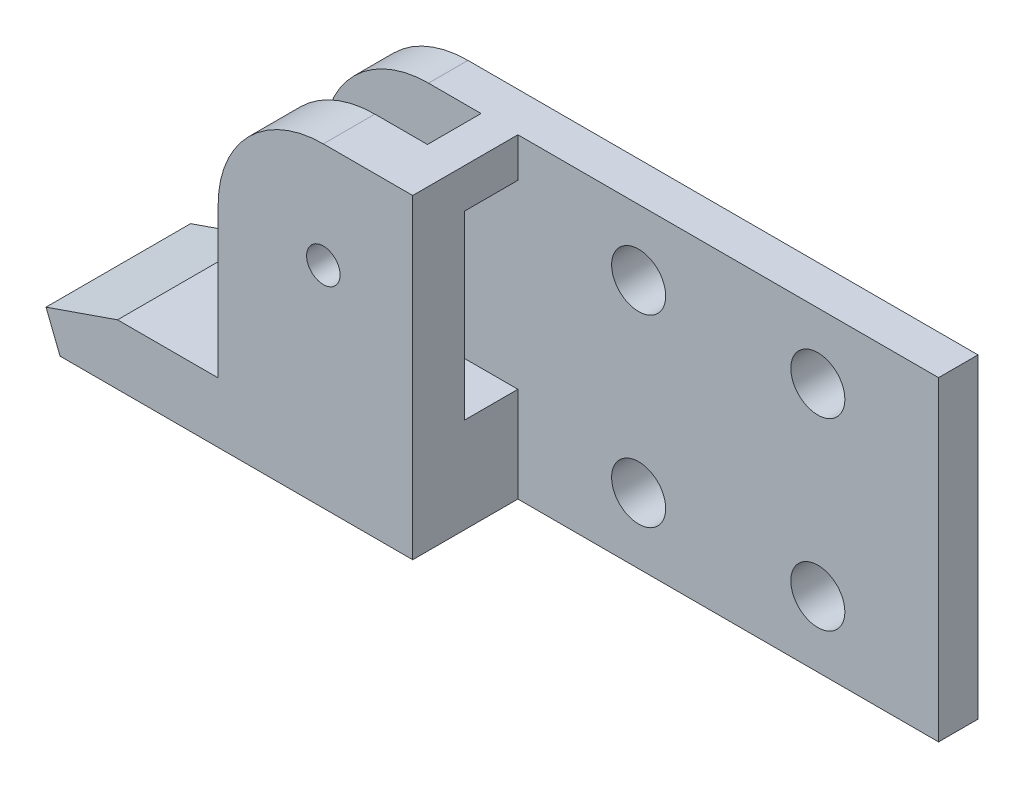
ISO-10303-21;
HEADER;
FILE_DESCRIPTION(('STEP AP214'),'2;1');
FILE_NAME('part.step','',(''),(''),'','','');
FILE_SCHEMA(('AUTOMOTIVE_DESIGN { 1 0 10303 214 1 1 1 1 }'));
ENDSEC;
DATA;
#1=APPLICATION_CONTEXT('core data for automotive mechanical design processes');
#2=APPLICATION_PROTOCOL_DEFINITION('international standard','automotive_design',2000,#1);
#3=PRODUCT_CONTEXT('',#1,'mechanical');
#4=PRODUCT('Part','Part','',(#3));
#5=PRODUCT_RELATED_PRODUCT_CATEGORY('part','',(#4));
#6=PRODUCT_DEFINITION_FORMATION('','',#4);
#7=PRODUCT_DEFINITION_CONTEXT('part definition',#1,'design');
#8=PRODUCT_DEFINITION('design','',#6,#7);
#9=PRODUCT_DEFINITION_SHAPE('','',#8);
#10=(LENGTH_UNIT() NAMED_UNIT(*) SI_UNIT(.MILLI.,.METRE.));
#11=(NAMED_UNIT(*) PLANE_ANGLE_UNIT() SI_UNIT($,.RADIAN.));
#12=(NAMED_UNIT(*) SI_UNIT($,.STERADIAN.) SOLID_ANGLE_UNIT());
#13=UNCERTAINTY_MEASURE_WITH_UNIT(LENGTH_MEASURE(1.E-05),#10,'distance_accuracy_value','');
#14=(GEOMETRIC_REPRESENTATION_CONTEXT(3) GLOBAL_UNCERTAINTY_ASSIGNED_CONTEXT((#13)) GLOBAL_UNIT_ASSIGNED_CONTEXT((#10,
#11,#12)) REPRESENTATION_CONTEXT('',''));
#15=CARTESIAN_POINT('',(0.,0.,0.));
#16=DIRECTION('',(0.,0.,1.));
#17=DIRECTION('',(1.,0.,0.));
#18=AXIS2_PLACEMENT_3D('',#15,#16,#17);
#19=CARTESIAN_POINT('',(-36.195000000001,-203.1333598559,4.7625));
#20=DIRECTION('',(0.,0.,-1.));
#21=DIRECTION('',(-1.,0.,0.));
#22=AXIS2_PLACEMENT_3D('',#19,#20,#21);
#23=CYLINDRICAL_SURFACE('',#22,12.7);
#24=DIRECTION('',(0.,0.,-1.));
#25=VECTOR('',#24,1.);
#26=CARTESIAN_POINT('',(-36.195000000001,-190.4333598559,4.7625));
#27=LINE('',#26,#25);
#28=CARTESIAN_POINT('',(-36.195000000001,-190.4333598559,17.4625));
#29=VERTEX_POINT('',#28);
#30=CARTESIAN_POINT('',(-36.195000000001,-190.4333598559,11.2395));
#31=VERTEX_POINT('',#30);
#32=EDGE_CURVE('E276',#29,#31,#27,.T.);
#33=ORIENTED_EDGE('',*,*,#32,.T.);
#34=CARTESIAN_POINT('',(-36.195000000001,-203.1333598559,11.2395));
#35=DIRECTION('',(0.,0.,-1.));
#36=DIRECTION('',(0.,1.,0.));
#37=AXIS2_PLACEMENT_3D('',#34,#35,#36);
#38=CIRCLE('',#37,12.7);
#39=CARTESIAN_POINT('',(-48.895000000001,-203.1333598559,11.2395));
#40=VERTEX_POINT('',#39);
#41=EDGE_CURVE('E202',#40,#31,#38,.T.);
#42=ORIENTED_EDGE('',*,*,#41,.F.);
#43=DIRECTION('',(0.,0.,-1.));
#44=VECTOR('',#43,1.);
#45=CARTESIAN_POINT('',(-48.895000000001,-203.1333598559,4.7625));
#46=LINE('',#45,#44);
#47=CARTESIAN_POINT('',(-48.895000000001,-203.1333598559,17.4625));
#48=VERTEX_POINT('',#47);
#49=EDGE_CURVE('E273',#48,#40,#46,.T.);
#50=ORIENTED_EDGE('',*,*,#49,.F.);
#51=CARTESIAN_POINT('',(-36.195000000001,-203.1333598559,17.4625));
#52=DIRECTION('',(0.,0.,-1.));
#53=DIRECTION('',(-1.,0.,0.));
#54=AXIS2_PLACEMENT_3D('',#51,#52,#53);
#55=CIRCLE('',#54,12.7);
#56=EDGE_CURVE('E227',#48,#29,#55,.T.);
#57=ORIENTED_EDGE('',*,*,#56,.T.);
#58=EDGE_LOOP('',(#33,#42,#50,#57));
#59=FACE_BOUND('',#58,.T.);
#60=ADVANCED_FACE('F38',(#59),#23,.T.);
#61=CARTESIAN_POINT('',(-36.195000000001,-203.1333598559,4.7625));
#62=DIRECTION('',(0.,0.,1.));
#63=DIRECTION('',(1.,0.,0.));
#64=AXIS2_PLACEMENT_3D('',#61,#62,#63);
#65=CIRCLE('',#64,12.7);
#66=CARTESIAN_POINT('',(-36.195000000001,-190.4333598559,4.7625));
#67=VERTEX_POINT('',#66);
#68=CARTESIAN_POINT('',(-48.895000000001,-203.1333598559,4.7625));
#69=VERTEX_POINT('',#68);
#70=EDGE_CURVE('E61',#67,#69,#65,.T.);
#71=ORIENTED_EDGE('',*,*,#70,.F.);
#72=CARTESIAN_POINT('',(-36.195000000001,-190.4333598559,0.));
#73=VERTEX_POINT('',#72);
#74=EDGE_CURVE('E178',#67,#73,#27,.T.);
#75=ORIENTED_EDGE('',*,*,#74,.T.);
#76=CARTESIAN_POINT('',(-36.195000000001,-203.1333598559,0.));
#77=DIRECTION('',(0.,0.,1.));
#78=DIRECTION('',(1.,0.,0.));
#79=AXIS2_PLACEMENT_3D('',#76,#77,#78);
#80=CIRCLE('',#79,12.7);
#81=CARTESIAN_POINT('',(-48.895000000001,-203.1333598559,0.));
#82=VERTEX_POINT('',#81);
#83=EDGE_CURVE('E261',#73,#82,#80,.T.);
#84=ORIENTED_EDGE('',*,*,#83,.T.);
#85=EDGE_CURVE('E272',#69,#82,#46,.T.);
#86=ORIENTED_EDGE('',*,*,#85,.F.);
#87=EDGE_LOOP('',(#71,#75,#84,#86));
#88=FACE_BOUND('',#87,.T.);
#89=ADVANCED_FACE('F336',(#88),#23,.T.);
#90=CARTESIAN_POINT('',(-36.195000000001,-190.4333598559,4.7625));
#91=DIRECTION('',(0.,-1.,0.));
#92=DIRECTION('',(0.,0.,-1.));
#93=AXIS2_PLACEMENT_3D('',#90,#91,#92);
#94=PLANE('',#93);
#95=DIRECTION('',(-1.,0.,0.));
#96=VECTOR('',#95,1.);
#97=CARTESIAN_POINT('',(-29.845000000001,-190.4333598559,11.2395));
#98=LINE('',#97,#96);
#99=CARTESIAN_POINT('',(-29.845000000001,-190.4333598559,11.2395));
#100=VERTEX_POINT('',#99);
#101=EDGE_CURVE('E179',#100,#31,#98,.T.);
#102=ORIENTED_EDGE('',*,*,#101,.T.);
#103=ORIENTED_EDGE('',*,*,#32,.F.);
#104=DIRECTION('',(1.,0.,0.));
#105=VECTOR('',#104,1.);
#106=CARTESIAN_POINT('',(-36.195000000001,-190.4333598559,17.4625));
#107=LINE('',#106,#105);
#108=CARTESIAN_POINT('',(-25.4000000000009,-190.4333598559,17.4625));
#109=VERTEX_POINT('',#108);
#110=EDGE_CURVE('E205',#29,#109,#107,.T.);
#111=ORIENTED_EDGE('',*,*,#110,.T.);
#112=DIRECTION('',(0.,0.,-1.));
#113=VECTOR('',#112,1.);
#114=CARTESIAN_POINT('',(-25.4000000000009,-190.4333598559,17.4625));
#115=LINE('',#114,#113);
#116=CARTESIAN_POINT('',(-25.4000000000009,-190.4333598559,4.7625));
#117=VERTEX_POINT('',#116);
#118=EDGE_CURVE('E230',#109,#117,#115,.T.);
#119=ORIENTED_EDGE('',*,*,#118,.T.);
#120=DIRECTION('',(-1.,0.,0.));
#121=VECTOR('',#120,1.);
#122=CARTESIAN_POINT('',(-36.195000000001,-190.4333598559,4.7625));
#123=LINE('',#122,#121);
#124=CARTESIAN_POINT('',(25.3999999999991,-190.4333598559,4.7625));
#125=VERTEX_POINT('',#124);
#126=EDGE_CURVE('E247',#125,#117,#123,.T.);
#127=ORIENTED_EDGE('',*,*,#126,.F.);
#128=DIRECTION('',(0.,0.,-1.));
#129=VECTOR('',#128,1.);
#130=CARTESIAN_POINT('',(25.3999999999991,-190.4333598559,4.7625));
#131=LINE('',#130,#129);
#132=CARTESIAN_POINT('',(25.3999999999991,-190.4333598559,0.));
#133=VERTEX_POINT('',#132);
#134=EDGE_CURVE('E279',#125,#133,#131,.T.);
#135=ORIENTED_EDGE('',*,*,#134,.T.);
#136=DIRECTION('',(-1.,0.,0.));
#137=VECTOR('',#136,1.);
#138=CARTESIAN_POINT('',(-36.195000000001,-190.4333598559,0.));
#139=LINE('',#138,#137);
#140=EDGE_CURVE('E259',#133,#73,#139,.T.);
#141=ORIENTED_EDGE('',*,*,#140,.T.);
#142=ORIENTED_EDGE('',*,*,#74,.F.);
#143=DIRECTION('',(-1.,0.,0.));
#144=VECTOR('',#143,1.);
#145=CARTESIAN_POINT('',(-29.845000000001,-190.4333598559,4.7625));
#146=LINE('',#145,#144);
#147=CARTESIAN_POINT('',(-29.845000000001,-190.4333598559,4.7625));
#148=VERTEX_POINT('',#147);
#149=EDGE_CURVE('E161',#148,#67,#146,.T.);
#150=ORIENTED_EDGE('',*,*,#149,.F.);
#151=DIRECTION('',(0.,0.,1.));
#152=VECTOR('',#151,1.);
#153=CARTESIAN_POINT('',(-29.845000000001,-190.4333598559,0.));
#154=LINE('',#153,#152);
#155=EDGE_CURVE('E166',#148,#100,#154,.T.);
#156=ORIENTED_EDGE('',*,*,#155,.T.);
#157=EDGE_LOOP('',(#102,#103,#111,#119,#127,#135,#141,#142,#150,#156));
#158=FACE_BOUND('',#157,.T.);
#159=ADVANCED_FACE('F176',(#158),#94,.F.);
#160=CARTESIAN_POINT('',(-24.765000000001,-195.1958598559,0.));
#161=DIRECTION('',(0.,-1.,0.));
#162=DIRECTION('',(1.,0.,0.));
#163=AXIS2_PLACEMENT_3D('',#160,#161,#162);
#164=PLANE('',#163);
#165=DIRECTION('',(-1.,0.,0.));
#166=VECTOR('',#165,1.);
#167=CARTESIAN_POINT('',(-24.765000000001,-195.1958598559,11.2395));
#168=LINE('',#167,#166);
#169=CARTESIAN_POINT('',(-25.4000000000009,-195.1958598559,11.2395));
#170=VERTEX_POINT('',#169);
#171=CARTESIAN_POINT('',(-29.845000000001,-195.1958598559,11.2395));
#172=VERTEX_POINT('',#171);
#173=EDGE_CURVE('E192',#170,#172,#168,.T.);
#174=ORIENTED_EDGE('',*,*,#173,.T.);
#175=DIRECTION('',(0.,0.,1.));
#176=VECTOR('',#175,1.);
#177=CARTESIAN_POINT('',(-29.845000000001,-195.1958598559,0.));
#178=LINE('',#177,#176);
#179=CARTESIAN_POINT('',(-29.845000000001,-195.1958598559,4.7625));
#180=VERTEX_POINT('',#179);
#181=EDGE_CURVE('E165',#180,#172,#178,.T.);
#182=ORIENTED_EDGE('',*,*,#181,.F.);
#183=DIRECTION('',(-1.,0.,0.));
#184=VECTOR('',#183,1.);
#185=CARTESIAN_POINT('',(-24.765000000001,-195.1958598559,4.7625));
#186=LINE('',#185,#184);
#187=CARTESIAN_POINT('',(-25.4000000000009,-195.1958598559,4.7625));
#188=VERTEX_POINT('',#187);
#189=EDGE_CURVE('E164',#188,#180,#186,.T.);
#190=ORIENTED_EDGE('',*,*,#189,.F.);
#191=DIRECTION('',(0.,0.,-1.));
#192=VECTOR('',#191,1.);
#193=CARTESIAN_POINT('',(-25.4000000000009,-195.1958598559,17.4625));
#194=LINE('',#193,#192);
#195=EDGE_CURVE('E291',#170,#188,#194,.T.);
#196=ORIENTED_EDGE('',*,*,#195,.F.);
#197=EDGE_LOOP('',(#174,#182,#190,#196));
#198=FACE_BOUND('',#197,.T.);
#199=ADVANCED_FACE('F362',(#198),#164,.T.);
#200=CARTESIAN_POINT('',(-48.895000000001,-221.260552334303,4.7625));
#201=DIRECTION('',(1.,0.,0.));
#202=DIRECTION('',(0.,1.,0.));
#203=AXIS2_PLACEMENT_3D('',#200,#201,#202);
#204=PLANE('',#203);
#205=DIRECTION('',(0.,-1.,0.));
#206=VECTOR('',#205,1.);
#207=CARTESIAN_POINT('',(-48.8950000000009,0.,11.2395));
#208=LINE('',#207,#206);
#209=CARTESIAN_POINT('',(-48.895000000001,-217.052510473162,11.2395));
#210=VERTEX_POINT('',#209);
#211=EDGE_CURVE('E181',#40,#210,#208,.T.);
#212=ORIENTED_EDGE('',*,*,#211,.T.);
#213=DIRECTION('',(0.,0.,-1.));
#214=VECTOR('',#213,1.);
#215=CARTESIAN_POINT('',(-48.895000000001,-217.052510473162,0.));
#216=LINE('',#215,#214);
#217=CARTESIAN_POINT('',(-48.895000000001,-217.052510473162,4.7625));
#218=VERTEX_POINT('',#217);
#219=EDGE_CURVE('E189',#210,#218,#216,.T.);
#220=ORIENTED_EDGE('',*,*,#219,.T.);
#221=DIRECTION('',(0.,1.,0.));
#222=VECTOR('',#221,1.);
#223=CARTESIAN_POINT('',(-48.8950000000009,0.,4.7625));
#224=LINE('',#223,#222);
#225=EDGE_CURVE('E187',#218,#69,#224,.T.);
#226=ORIENTED_EDGE('',*,*,#225,.T.);
#227=ORIENTED_EDGE('',*,*,#85,.T.);
#228=DIRECTION('',(0.,-1.,0.));
#229=VECTOR('',#228,1.);
#230=CARTESIAN_POINT('',(-48.895000000001,-221.260552334303,0.));
#231=LINE('',#230,#229);
#232=CARTESIAN_POINT('',(-48.895000000001,-221.260552334303,0.));
#233=VERTEX_POINT('',#232);
#234=EDGE_CURVE('E264',#82,#233,#231,.T.);
#235=ORIENTED_EDGE('',*,*,#234,.T.);
#236=DIRECTION('',(0.,0.,-1.));
#237=VECTOR('',#236,1.);
#238=CARTESIAN_POINT('',(-48.895000000001,-221.260552334303,4.7625));
#239=LINE('',#238,#237);
#240=CARTESIAN_POINT('',(-48.895000000001,-221.260552334303,17.4625));
#241=VERTEX_POINT('',#240);
#242=EDGE_CURVE('E269',#241,#233,#239,.T.);
#243=ORIENTED_EDGE('',*,*,#242,.F.);
#244=DIRECTION('',(0.,1.,0.));
#245=VECTOR('',#244,1.);
#246=CARTESIAN_POINT('',(-48.895000000001,-221.260552334303,17.4625));
#247=LINE('',#246,#245);
#248=EDGE_CURVE('E224',#241,#48,#247,.T.);
#249=ORIENTED_EDGE('',*,*,#248,.T.);
#250=ORIENTED_EDGE('',*,*,#49,.T.);
#251=EDGE_LOOP('',(#212,#220,#226,#227,#235,#243,#249,#250));
#252=FACE_BOUND('',#251,.T.);
#253=ADVANCED_FACE('F306',(#252),#204,.F.);
#254=CARTESIAN_POINT('',(-25.4000000000009,-190.4333598559,17.4625));
#255=DIRECTION('',(1.,0.,0.));
#256=DIRECTION('',(0.,0.,-1.));
#257=AXIS2_PLACEMENT_3D('',#254,#255,#256);
#258=PLANE('',#257);
#259=DIRECTION('',(0.,-1.,0.));
#260=VECTOR('',#259,1.);
#261=CARTESIAN_POINT('',(-25.4000000000009,-190.4333598559,4.7625));
#262=LINE('',#261,#260);
#263=CARTESIAN_POINT('',(-25.4000000000009,-217.052510473162,4.7625));
#264=VERTEX_POINT('',#263);
#265=CARTESIAN_POINT('',(-25.4000000000009,-228.533359855901,4.7625));
#266=VERTEX_POINT('',#265);
#267=EDGE_CURVE('E204',#264,#266,#262,.T.);
#268=ORIENTED_EDGE('',*,*,#267,.F.);
#269=DIRECTION('',(0.,0.,1.));
#270=VECTOR('',#269,1.);
#271=CARTESIAN_POINT('',(-25.4000000000009,-217.052510473162,17.4625));
#272=LINE('',#271,#270);
#273=CARTESIAN_POINT('',(-25.4000000000009,-217.052510473162,11.2395));
#274=VERTEX_POINT('',#273);
#275=EDGE_CURVE('E11',#264,#274,#272,.T.);
#276=ORIENTED_EDGE('',*,*,#275,.T.);
#277=DIRECTION('',(0.,1.,0.));
#278=VECTOR('',#277,1.);
#279=CARTESIAN_POINT('',(-25.4000000000009,-190.4333598559,11.2395));
#280=LINE('',#279,#278);
#281=EDGE_CURVE('E46',#274,#170,#280,.T.);
#282=ORIENTED_EDGE('',*,*,#281,.T.);
#283=ORIENTED_EDGE('',*,*,#195,.T.);
#284=EDGE_CURVE('E209',#117,#188,#262,.T.);
#285=ORIENTED_EDGE('',*,*,#284,.F.);
#286=ORIENTED_EDGE('',*,*,#118,.F.);
#287=DIRECTION('',(0.,-1.,0.));
#288=VECTOR('',#287,1.);
#289=CARTESIAN_POINT('',(-25.4000000000009,-190.4333598559,17.4625));
#290=LINE('',#289,#288);
#291=CARTESIAN_POINT('',(-25.4000000000009,-228.533359855901,17.4625));
#292=VERTEX_POINT('',#291);
#293=EDGE_CURVE('E208',#109,#292,#290,.T.);
#294=ORIENTED_EDGE('',*,*,#293,.T.);
#295=DIRECTION('',(0.,0.,-1.));
#296=VECTOR('',#295,1.);
#297=CARTESIAN_POINT('',(-25.4000000000009,-228.533359855901,17.4625));
#298=LINE('',#297,#296);
#299=EDGE_CURVE('E232',#292,#266,#298,.T.);
#300=ORIENTED_EDGE('',*,*,#299,.T.);
#301=EDGE_LOOP('',(#268,#276,#282,#283,#285,#286,#294,#300));
#302=FACE_BOUND('',#301,.T.);
#303=ADVANCED_FACE('F296',(#302),#258,.T.);
#304=CARTESIAN_POINT('',(-36.195000000001,-203.1333598559,4.7625));
#305=DIRECTION('',(0.,0.,1.));
#306=DIRECTION('',(1.,0.,0.));
#307=AXIS2_PLACEMENT_3D('',#304,#305,#306);
#308=PLANE('',#307);
#309=CARTESIAN_POINT('',(-10.8204,-198.3708598559,4.7625));
#310=DIRECTION('',(0.,0.,1.));
#311=DIRECTION('',(1.,0.,0.));
#312=AXIS2_PLACEMENT_3D('',#309,#310,#311);
#313=CIRCLE('',#312,3.2639);
#314=CARTESIAN_POINT('',(-7.5565,-198.3708598559,4.7625));
#315=VERTEX_POINT('',#314);
#316=EDGE_CURVE('E630',#315,#315,#313,.T.);
#317=ORIENTED_EDGE('',*,*,#316,.F.);
#318=EDGE_LOOP('',(#317));
#319=FACE_BOUND('',#318,.T.);
#320=CARTESIAN_POINT('',(-10.8204,-220.5958598559,4.7625));
#321=DIRECTION('',(0.,0.,1.));
#322=DIRECTION('',(1.,0.,0.));
#323=AXIS2_PLACEMENT_3D('',#320,#321,#322);
#324=CIRCLE('',#323,3.2639);
#325=CARTESIAN_POINT('',(-7.5565,-220.5958598559,4.7625));
#326=VERTEX_POINT('',#325);
#327=EDGE_CURVE('E632',#326,#326,#324,.T.);
#328=ORIENTED_EDGE('',*,*,#327,.F.);
#329=EDGE_LOOP('',(#328));
#330=FACE_BOUND('',#329,.T.);
#331=CARTESIAN_POINT('',(10.8204,-220.5958598559,4.7625));
#332=DIRECTION('',(0.,0.,1.));
#333=DIRECTION('',(1.,0.,0.));
#334=AXIS2_PLACEMENT_3D('',#331,#332,#333);
#335=CIRCLE('',#334,3.2639);
#336=CARTESIAN_POINT('',(14.0843,-220.5958598559,4.7625));
#337=VERTEX_POINT('',#336);
#338=EDGE_CURVE('E640',#337,#337,#335,.T.);
#339=ORIENTED_EDGE('',*,*,#338,.F.);
#340=EDGE_LOOP('',(#339));
#341=FACE_BOUND('',#340,.T.);
#342=CARTESIAN_POINT('',(10.8204,-198.3708598559,4.7625));
#343=DIRECTION('',(0.,0.,1.));
#344=DIRECTION('',(1.,0.,0.));
#345=AXIS2_PLACEMENT_3D('',#342,#343,#344);
#346=CIRCLE('',#345,3.2639);
#347=CARTESIAN_POINT('',(14.0843,-198.3708598559,4.7625));
#348=VERTEX_POINT('',#347);
#349=EDGE_CURVE('E646',#348,#348,#346,.T.);
#350=ORIENTED_EDGE('',*,*,#349,.F.);
#351=EDGE_LOOP('',(#350));
#352=FACE_BOUND('',#351,.T.);
#353=DIRECTION('',(-1.,0.,0.));
#354=VECTOR('',#353,1.);
#355=CARTESIAN_POINT('',(-24.765000000001,-217.052510473162,4.7625));
#356=LINE('',#355,#354);
#357=EDGE_CURVE('E195',#264,#218,#356,.T.);
#358=ORIENTED_EDGE('',*,*,#357,.F.);
#359=ORIENTED_EDGE('',*,*,#267,.T.);
#360=DIRECTION('',(1.,0.,0.));
#361=VECTOR('',#360,1.);
#362=CARTESIAN_POINT('',(25.3999999999991,-228.533359855901,4.7625));
#363=LINE('',#362,#361);
#364=CARTESIAN_POINT('',(25.3999999999991,-228.533359855901,4.7625));
#365=VERTEX_POINT('',#364);
#366=EDGE_CURVE('E242',#266,#365,#363,.T.);
#367=ORIENTED_EDGE('',*,*,#366,.T.);
#368=DIRECTION('',(0.,1.,0.));
#369=VECTOR('',#368,1.);
#370=CARTESIAN_POINT('',(25.3999999999991,-190.4333598559,4.7625));
#371=LINE('',#370,#369);
#372=EDGE_CURVE('E244',#365,#125,#371,.T.);
#373=ORIENTED_EDGE('',*,*,#372,.T.);
#374=ORIENTED_EDGE('',*,*,#126,.T.);
#375=ORIENTED_EDGE('',*,*,#284,.T.);
#376=ORIENTED_EDGE('',*,*,#189,.T.);
#377=DIRECTION('',(0.,1.,0.));
#378=VECTOR('',#377,1.);
#379=CARTESIAN_POINT('',(-29.8450000000009,0.,4.7625));
#380=LINE('',#379,#378);
#381=EDGE_CURVE('E53',#180,#148,#380,.T.);
#382=ORIENTED_EDGE('',*,*,#381,.T.);
#383=ORIENTED_EDGE('',*,*,#149,.T.);
#384=ORIENTED_EDGE('',*,*,#70,.T.);
#385=ORIENTED_EDGE('',*,*,#225,.F.);
#386=EDGE_LOOP('',(#358,#359,#367,#373,#374,#375,#376,#382,#383,#384,#385));
#387=FACE_BOUND('',#386,.T.);
#388=CARTESIAN_POINT('',(-36.195000000001,-203.1333598559,4.7625));
#389=DIRECTION('',(0.,0.,1.));
#390=DIRECTION('',(1.,0.,0.));
#391=AXIS2_PLACEMENT_3D('',#388,#389,#390);
#392=CIRCLE('',#391,3.175);
#393=CARTESIAN_POINT('',(-39.370000000001,-203.1333598559,4.7625));
#394=VERTEX_POINT('',#393);
#395=EDGE_CURVE('E201',#394,#394,#392,.T.);
#396=ORIENTED_EDGE('',*,*,#395,.F.);
#397=EDGE_LOOP('',(#396));
#398=FACE_BOUND('',#397,.T.);
#399=ADVANCED_FACE('F158',(#319,#330,#341,#352,#387,#398),#308,.T.);
#400=CARTESIAN_POINT('',(-36.195000000001,-203.1333598559,0.));
#401=DIRECTION('',(0.,0.,1.));
#402=DIRECTION('',(1.,0.,0.));
#403=AXIS2_PLACEMENT_3D('',#400,#401,#402);
#404=PLANE('',#403);
#405=CARTESIAN_POINT('',(-10.8204,-198.3708598559,0.));
#406=DIRECTION('',(0.,0.,1.));
#407=DIRECTION('',(1.,0.,0.));
#408=AXIS2_PLACEMENT_3D('',#405,#406,#407);
#409=CIRCLE('',#408,3.2639);
#410=CARTESIAN_POINT('',(-7.5565,-198.3708598559,0.));
#411=VERTEX_POINT('',#410);
#412=EDGE_CURVE('E627',#411,#411,#409,.T.);
#413=ORIENTED_EDGE('',*,*,#412,.T.);
#414=EDGE_LOOP('',(#413));
#415=FACE_BOUND('',#414,.T.);
#416=CARTESIAN_POINT('',(-10.8204,-220.5958598559,0.));
#417=DIRECTION('',(0.,0.,1.));
#418=DIRECTION('',(1.,0.,0.));
#419=AXIS2_PLACEMENT_3D('',#416,#417,#418);
#420=CIRCLE('',#419,3.2639);
#421=CARTESIAN_POINT('',(-7.5565,-220.5958598559,0.));
#422=VERTEX_POINT('',#421);
#423=EDGE_CURVE('E637',#422,#422,#420,.T.);
#424=ORIENTED_EDGE('',*,*,#423,.T.);
#425=EDGE_LOOP('',(#424));
#426=FACE_BOUND('',#425,.T.);
#427=CARTESIAN_POINT('',(10.8204,-220.5958598559,0.));
#428=DIRECTION('',(0.,0.,1.));
#429=DIRECTION('',(1.,0.,0.));
#430=AXIS2_PLACEMENT_3D('',#427,#428,#429);
#431=CIRCLE('',#430,3.2639);
#432=CARTESIAN_POINT('',(14.0843,-220.5958598559,0.));
#433=VERTEX_POINT('',#432);
#434=EDGE_CURVE('E643',#433,#433,#431,.T.);
#435=ORIENTED_EDGE('',*,*,#434,.T.);
#436=EDGE_LOOP('',(#435));
#437=FACE_BOUND('',#436,.T.);
#438=CARTESIAN_POINT('',(10.8204,-198.3708598559,0.));
#439=DIRECTION('',(0.,0.,1.));
#440=DIRECTION('',(1.,0.,0.));
#441=AXIS2_PLACEMENT_3D('',#438,#439,#440);
#442=CIRCLE('',#441,3.2639);
#443=CARTESIAN_POINT('',(14.0843,-198.3708598559,0.));
#444=VERTEX_POINT('',#443);
#445=EDGE_CURVE('E649',#444,#444,#442,.T.);
#446=ORIENTED_EDGE('',*,*,#445,.T.);
#447=EDGE_LOOP('',(#446));
#448=FACE_BOUND('',#447,.T.);
#449=DIRECTION('',(-0.944948295670195,-0.327219679282884,0.));
#450=VECTOR('',#449,1.);
#451=CARTESIAN_POINT('',(-69.6868563657894,-224.252380141043,0.));
#452=LINE('',#451,#450);
#453=CARTESIAN_POINT('',(-61.0470257996289,-221.260552334303,0.));
#454=VERTEX_POINT('',#453);
#455=CARTESIAN_POINT('',(-69.6868563657894,-224.252380141043,0.));
#456=VERTEX_POINT('',#455);
#457=EDGE_CURVE('E241',#454,#456,#452,.T.);
#458=ORIENTED_EDGE('',*,*,#457,.F.);
#459=DIRECTION('',(-1.,0.,0.));
#460=VECTOR('',#459,1.);
#461=CARTESIAN_POINT('',(-61.0470257996289,-221.260552334303,0.));
#462=LINE('',#461,#460);
#463=EDGE_CURVE('E245',#233,#454,#462,.T.);
#464=ORIENTED_EDGE('',*,*,#463,.F.);
#465=ORIENTED_EDGE('',*,*,#234,.F.);
#466=ORIENTED_EDGE('',*,*,#83,.F.);
#467=ORIENTED_EDGE('',*,*,#140,.F.);
#468=DIRECTION('',(0.,1.,0.));
#469=VECTOR('',#468,1.);
#470=CARTESIAN_POINT('',(25.3999999999991,-190.4333598559,0.));
#471=LINE('',#470,#469);
#472=CARTESIAN_POINT('',(25.3999999999991,-228.533359855901,0.));
#473=VERTEX_POINT('',#472);
#474=EDGE_CURVE('E257',#473,#133,#471,.T.);
#475=ORIENTED_EDGE('',*,*,#474,.F.);
#476=DIRECTION('',(1.,0.,0.));
#477=VECTOR('',#476,1.);
#478=CARTESIAN_POINT('',(25.3999999999991,-228.533359855901,0.));
#479=LINE('',#478,#477);
#480=CARTESIAN_POINT('',(-67.9861863425909,-228.533359855901,0.));
#481=VERTEX_POINT('',#480);
#482=EDGE_CURVE('E255',#481,#473,#479,.T.);
#483=ORIENTED_EDGE('',*,*,#482,.F.);
#484=DIRECTION('',(0.369195948458416,-0.929351575907573,0.));
#485=VECTOR('',#484,1.);
#486=CARTESIAN_POINT('',(-67.9861863425909,-228.533359855901,0.));
#487=LINE('',#486,#485);
#488=EDGE_CURVE('E253',#456,#481,#487,.T.);
#489=ORIENTED_EDGE('',*,*,#488,.F.);
#490=EDGE_LOOP('',(#458,#464,#465,#466,#467,#475,#483,#489));
#491=FACE_BOUND('',#490,.T.);
#492=CARTESIAN_POINT('',(-36.195000000001,-203.1333598559,0.));
#493=DIRECTION('',(0.,0.,1.));
#494=DIRECTION('',(1.,0.,0.));
#495=AXIS2_PLACEMENT_3D('',#492,#493,#494);
#496=CIRCLE('',#495,3.175);
#497=CARTESIAN_POINT('',(-39.370000000001,-203.1333598559,0.));
#498=VERTEX_POINT('',#497);
#499=EDGE_CURVE('E235',#498,#498,#496,.T.);
#500=ORIENTED_EDGE('',*,*,#499,.T.);
#501=EDGE_LOOP('',(#500));
#502=FACE_BOUND('',#501,.T.);
#503=ADVANCED_FACE('F329',(#415,#426,#437,#448,#491,#502),#404,.F.);
#504=CARTESIAN_POINT('',(-69.6868563657894,-224.252380141043,4.7625));
#505=DIRECTION('',(0.327219679282884,-0.944948295670195,0.));
#506=DIRECTION('',(0.944948295670195,0.327219679282884,0.));
#507=AXIS2_PLACEMENT_3D('',#504,#505,#506);
#508=PLANE('',#507);
#509=ORIENTED_EDGE('',*,*,#457,.T.);
#510=DIRECTION('',(0.,0.,-1.));
#511=VECTOR('',#510,1.);
#512=CARTESIAN_POINT('',(-69.6868563657894,-224.252380141043,4.7625));
#513=LINE('',#512,#511);
#514=CARTESIAN_POINT('',(-69.6868563657894,-224.252380141043,17.4625));
#515=VERTEX_POINT('',#514);
#516=EDGE_CURVE('E288',#515,#456,#513,.T.);
#517=ORIENTED_EDGE('',*,*,#516,.F.);
#518=DIRECTION('',(0.944948295670195,0.327219679282884,0.));
#519=VECTOR('',#518,1.);
#520=CARTESIAN_POINT('',(-69.6868563657894,-224.252380141043,17.4625));
#521=LINE('',#520,#519);
#522=CARTESIAN_POINT('',(-61.0470257996289,-221.260552334303,17.4625));
#523=VERTEX_POINT('',#522);
#524=EDGE_CURVE('E218',#515,#523,#521,.T.);
#525=ORIENTED_EDGE('',*,*,#524,.T.);
#526=DIRECTION('',(0.,0.,-1.));
#527=VECTOR('',#526,1.);
#528=CARTESIAN_POINT('',(-61.0470257996289,-221.260552334303,4.7625));
#529=LINE('',#528,#527);
#530=EDGE_CURVE('E250',#523,#454,#529,.T.);
#531=ORIENTED_EDGE('',*,*,#530,.T.);
#532=EDGE_LOOP('',(#509,#517,#525,#531));
#533=FACE_BOUND('',#532,.T.);
#534=ADVANCED_FACE('F40',(#533),#508,.F.);
#535=CARTESIAN_POINT('',(-67.9861863425909,-228.533359855901,4.7625));
#536=DIRECTION('',(0.929351575907574,0.369195948458417,0.));
#537=DIRECTION('',(-0.369195948458417,0.929351575907574,0.));
#538=AXIS2_PLACEMENT_3D('',#535,#536,#537);
#539=PLANE('',#538);
#540=ORIENTED_EDGE('',*,*,#488,.T.);
#541=DIRECTION('',(0.,0.,-1.));
#542=VECTOR('',#541,1.);
#543=CARTESIAN_POINT('',(-67.9861863425909,-228.533359855901,4.7625));
#544=LINE('',#543,#542);
#545=CARTESIAN_POINT('',(-67.9861863425909,-228.533359855901,17.4625));
#546=VERTEX_POINT('',#545);
#547=EDGE_CURVE('E285',#546,#481,#544,.T.);
#548=ORIENTED_EDGE('',*,*,#547,.F.);
#549=DIRECTION('',(-0.369195948458416,0.929351575907573,0.));
#550=VECTOR('',#549,1.);
#551=CARTESIAN_POINT('',(-67.9861863425909,-228.533359855901,17.4625));
#552=LINE('',#551,#550);
#553=EDGE_CURVE('E215',#546,#515,#552,.T.);
#554=ORIENTED_EDGE('',*,*,#553,.T.);
#555=ORIENTED_EDGE('',*,*,#516,.T.);
#556=EDGE_LOOP('',(#540,#548,#554,#555));
#557=FACE_BOUND('',#556,.T.);
#558=ADVANCED_FACE('F343',(#557),#539,.F.);
#559=CARTESIAN_POINT('',(25.3999999999991,-228.533359855901,4.7625));
#560=DIRECTION('',(0.,1.,0.));
#561=DIRECTION('',(0.,0.,1.));
#562=AXIS2_PLACEMENT_3D('',#559,#560,#561);
#563=PLANE('',#562);
#564=ORIENTED_EDGE('',*,*,#482,.T.);
#565=DIRECTION('',(0.,0.,-1.));
#566=VECTOR('',#565,1.);
#567=CARTESIAN_POINT('',(25.3999999999991,-228.533359855901,4.7625));
#568=LINE('',#567,#566);
#569=EDGE_CURVE('E282',#365,#473,#568,.T.);
#570=ORIENTED_EDGE('',*,*,#569,.F.);
#571=ORIENTED_EDGE('',*,*,#366,.F.);
#572=ORIENTED_EDGE('',*,*,#299,.F.);
#573=DIRECTION('',(-1.,0.,0.));
#574=VECTOR('',#573,1.);
#575=CARTESIAN_POINT('',(-25.4000000000009,-228.533359855901,17.4625));
#576=LINE('',#575,#574);
#577=EDGE_CURVE('E212',#292,#546,#576,.T.);
#578=ORIENTED_EDGE('',*,*,#577,.T.);
#579=ORIENTED_EDGE('',*,*,#547,.T.);
#580=EDGE_LOOP('',(#564,#570,#571,#572,#578,#579));
#581=FACE_BOUND('',#580,.T.);
#582=ADVANCED_FACE('F345',(#581),#563,.F.);
#583=CARTESIAN_POINT('',(25.3999999999991,-190.4333598559,4.7625));
#584=DIRECTION('',(-1.,0.,0.));
#585=DIRECTION('',(0.,-1.,0.));
#586=AXIS2_PLACEMENT_3D('',#583,#584,#585);
#587=PLANE('',#586);
#588=ORIENTED_EDGE('',*,*,#474,.T.);
#589=ORIENTED_EDGE('',*,*,#134,.F.);
#590=ORIENTED_EDGE('',*,*,#372,.F.);
#591=ORIENTED_EDGE('',*,*,#569,.T.);
#592=EDGE_LOOP('',(#588,#589,#590,#591));
#593=FACE_BOUND('',#592,.T.);
#594=ADVANCED_FACE('F324',(#593),#587,.F.);
#595=CARTESIAN_POINT('',(-61.0470257996289,-221.260552334303,4.7625));
#596=DIRECTION('',(0.,-1.,0.));
#597=DIRECTION('',(0.,0.,-1.));
#598=AXIS2_PLACEMENT_3D('',#595,#596,#597);
#599=PLANE('',#598);
#600=ORIENTED_EDGE('',*,*,#463,.T.);
#601=ORIENTED_EDGE('',*,*,#530,.F.);
#602=DIRECTION('',(1.,0.,0.));
#603=VECTOR('',#602,1.);
#604=CARTESIAN_POINT('',(-61.0470257996289,-221.260552334303,17.4625));
#605=LINE('',#604,#603);
#606=EDGE_CURVE('E221',#523,#241,#605,.T.);
#607=ORIENTED_EDGE('',*,*,#606,.T.);
#608=ORIENTED_EDGE('',*,*,#242,.T.);
#609=EDGE_LOOP('',(#600,#601,#607,#608));
#610=FACE_BOUND('',#609,.T.);
#611=ADVANCED_FACE('F338',(#610),#599,.F.);
#612=CARTESIAN_POINT('',(-36.195000000001,-203.1333598559,4.7625));
#613=DIRECTION('',(0.,0.,-1.));
#614=DIRECTION('',(-1.,0.,0.));
#615=AXIS2_PLACEMENT_3D('',#612,#613,#614);
#616=CYLINDRICAL_SURFACE('',#615,3.175);
#617=CARTESIAN_POINT('',(-39.370000000001,-203.1333598559,4.7625));
#618=CARTESIAN_POINT('',(-39.370000000001,-203.1333598559,4.712890625));
#619=CARTESIAN_POINT('',(-39.370000000001,-203.1333598559,4.66328125));
#620=CARTESIAN_POINT('',(-39.370000000001,-203.1333598559,4.5640625));
#621=CARTESIAN_POINT('',(-39.370000000001,-203.1333598559,4.514453125));
#622=CARTESIAN_POINT('',(-39.370000000001,-203.1333598559,4.415234375));
#623=CARTESIAN_POINT('',(-39.370000000001,-203.1333598559,4.365625));
#624=CARTESIAN_POINT('',(-39.370000000001,-203.1333598559,4.26640625));
#625=CARTESIAN_POINT('',(-39.370000000001,-203.1333598559,4.216796875));
#626=CARTESIAN_POINT('',(-39.370000000001,-203.1333598559,4.117578125));
#627=CARTESIAN_POINT('',(-39.370000000001,-203.1333598559,4.06796875));
#628=CARTESIAN_POINT('',(-39.370000000001,-203.1333598559,3.96875));
#629=CARTESIAN_POINT('',(-39.370000000001,-203.1333598559,3.919140625));
#630=CARTESIAN_POINT('',(-39.370000000001,-203.1333598559,3.819921875));
#631=CARTESIAN_POINT('',(-39.370000000001,-203.1333598559,3.7703125));
#632=CARTESIAN_POINT('',(-39.370000000001,-203.1333598559,3.67109375));
#633=CARTESIAN_POINT('',(-39.370000000001,-203.1333598559,3.621484375));
#634=CARTESIAN_POINT('',(-39.370000000001,-203.1333598559,3.522265625));
#635=CARTESIAN_POINT('',(-39.370000000001,-203.1333598559,3.47265625));
#636=CARTESIAN_POINT('',(-39.370000000001,-203.1333598559,3.3734375));
#637=CARTESIAN_POINT('',(-39.370000000001,-203.1333598559,3.323828125));
#638=CARTESIAN_POINT('',(-39.370000000001,-203.1333598559,3.224609375));
#639=CARTESIAN_POINT('',(-39.370000000001,-203.1333598559,3.175));
#640=CARTESIAN_POINT('',(-39.370000000001,-203.1333598559,3.07578125));
#641=CARTESIAN_POINT('',(-39.370000000001,-203.1333598559,3.026171875));
#642=CARTESIAN_POINT('',(-39.370000000001,-203.1333598559,2.926953125));
#643=CARTESIAN_POINT('',(-39.370000000001,-203.1333598559,2.87734375));
#644=CARTESIAN_POINT('',(-39.370000000001,-203.1333598559,2.778125));
#645=CARTESIAN_POINT('',(-39.370000000001,-203.1333598559,2.728515625));
#646=CARTESIAN_POINT('',(-39.370000000001,-203.1333598559,2.629296875));
#647=CARTESIAN_POINT('',(-39.370000000001,-203.1333598559,2.5796875));
#648=CARTESIAN_POINT('',(-39.370000000001,-203.1333598559,2.48046875));
#649=CARTESIAN_POINT('',(-39.370000000001,-203.1333598559,2.430859375));
#650=CARTESIAN_POINT('',(-39.370000000001,-203.1333598559,2.331640625));
#651=CARTESIAN_POINT('',(-39.370000000001,-203.1333598559,2.28203125));
#652=CARTESIAN_POINT('',(-39.370000000001,-203.1333598559,2.1828125));
#653=CARTESIAN_POINT('',(-39.370000000001,-203.1333598559,2.133203125));
#654=CARTESIAN_POINT('',(-39.370000000001,-203.1333598559,2.033984375));
#655=CARTESIAN_POINT('',(-39.370000000001,-203.1333598559,1.984375));
#656=CARTESIAN_POINT('',(-39.370000000001,-203.1333598559,1.88515625));
#657=CARTESIAN_POINT('',(-39.370000000001,-203.1333598559,1.835546875));
#658=CARTESIAN_POINT('',(-39.370000000001,-203.1333598559,1.736328125));
#659=CARTESIAN_POINT('',(-39.370000000001,-203.1333598559,1.68671875));
#660=CARTESIAN_POINT('',(-39.370000000001,-203.1333598559,1.5875));
#661=CARTESIAN_POINT('',(-39.370000000001,-203.1333598559,1.537890625));
#662=CARTESIAN_POINT('',(-39.370000000001,-203.1333598559,1.438671875));
#663=CARTESIAN_POINT('',(-39.370000000001,-203.1333598559,1.3890625));
#664=CARTESIAN_POINT('',(-39.370000000001,-203.1333598559,1.28984375));
#665=CARTESIAN_POINT('',(-39.370000000001,-203.1333598559,1.240234375));
#666=CARTESIAN_POINT('',(-39.370000000001,-203.1333598559,1.141015625));
#667=CARTESIAN_POINT('',(-39.370000000001,-203.1333598559,1.09140625));
#668=CARTESIAN_POINT('',(-39.370000000001,-203.1333598559,0.9921875));
#669=CARTESIAN_POINT('',(-39.370000000001,-203.1333598559,0.942578125));
#670=CARTESIAN_POINT('',(-39.370000000001,-203.1333598559,0.843359375));
#671=CARTESIAN_POINT('',(-39.370000000001,-203.1333598559,0.79375));
#672=CARTESIAN_POINT('',(-39.370000000001,-203.1333598559,0.69453125));
#673=CARTESIAN_POINT('',(-39.370000000001,-203.1333598559,0.644921875));
#674=CARTESIAN_POINT('',(-39.370000000001,-203.1333598559,0.545703125));
#675=CARTESIAN_POINT('',(-39.370000000001,-203.1333598559,0.49609375));
#676=CARTESIAN_POINT('',(-39.370000000001,-203.1333598559,0.396875));
#677=CARTESIAN_POINT('',(-39.370000000001,-203.1333598559,0.347265625));
#678=CARTESIAN_POINT('',(-39.370000000001,-203.1333598559,0.248046875));
#679=CARTESIAN_POINT('',(-39.370000000001,-203.1333598559,0.1984375));
#680=CARTESIAN_POINT('',(-39.370000000001,-203.1333598559,0.09921875));
#681=CARTESIAN_POINT('',(-39.370000000001,-203.1333598559,0.049609375));
#682=CARTESIAN_POINT('',(-39.370000000001,-203.1333598559,0.));
#683=B_SPLINE_CURVE_WITH_KNOTS('',3,(#617,#618,#619,#620,#621,#622,#623,#624,#625,#626,#627,
#628,#629,#630,#631,#632,#633,#634,#635,#636,#637,#638,#639,#640,#641,#642,#643,#644,#645,#646,
#647,#648,#649,#650,#651,#652,#653,#654,#655,#656,#657,#658,#659,#660,#661,#662,#663,#664,#665,
#666,#667,#668,#669,#670,#671,#672,#673,#674,#675,#676,#677,#678,#679,#680,#681,#682),
.UNSPECIFIED.,.F.,.F.,(4,2,2,2,2,2,2,2,2,2,2,2,2,2,2,2,2,2,2,2,2,2,2,2,2,2,2,2,2,2,2,2,4),(0.,
0.148828124999999,0.297656249999999,0.446484374999999,0.595312499999999,0.744140625,0.89296875,
1.041796875,1.190625,1.339453125,1.48828125,1.637109375,1.7859375,1.934765625,2.08359375,
2.232421875,2.38125,2.530078125,2.67890625,2.827734375,2.9765625,3.125390625,3.27421875,
3.423046875,3.571875,3.720703125,3.86953125,4.018359375,4.1671875,4.316015625,4.46484375,
4.613671875,4.7625),.UNSPECIFIED.);
#684=EDGE_CURVE('BSEAM379',#394,#498,#683,.T.);
#685=ORIENTED_EDGE('',*,*,#395,.T.);
#686=ORIENTED_EDGE('',*,*,#499,.F.);
#687=ORIENTED_EDGE('',*,*,#684,.T.);
#688=ORIENTED_EDGE('',*,*,#684,.F.);
#689=EDGE_LOOP('',(#685,#687,#686,#688));
#690=FACE_BOUND('',#689,.T.);
#691=ADVANCED_FACE('F379',(#690),#616,.F.);
#692=CARTESIAN_POINT('',(-36.195000000001,-203.1333598559,17.4625));
#693=DIRECTION('',(0.,0.,-1.));
#694=DIRECTION('',(-1.,0.,0.));
#695=AXIS2_PLACEMENT_3D('',#692,#693,#694);
#696=PLANE('',#695);
#697=CARTESIAN_POINT('',(-36.195000000001,-203.1333598559,17.4625));
#698=DIRECTION('',(0.,0.,-1.));
#699=DIRECTION('',(0.,1.,0.));
#700=AXIS2_PLACEMENT_3D('',#697,#698,#699);
#701=CIRCLE('',#700,2.0193);
#702=CARTESIAN_POINT('',(-36.195000000001,-201.1140598559,17.4625));
#703=VERTEX_POINT('',#702);
#704=EDGE_CURVE('E174',#703,#703,#701,.T.);
#705=ORIENTED_EDGE('',*,*,#704,.T.);
#706=EDGE_LOOP('',(#705));
#707=FACE_BOUND('',#706,.T.);
#708=ORIENTED_EDGE('',*,*,#110,.F.);
#709=ORIENTED_EDGE('',*,*,#56,.F.);
#710=ORIENTED_EDGE('',*,*,#248,.F.);
#711=ORIENTED_EDGE('',*,*,#606,.F.);
#712=ORIENTED_EDGE('',*,*,#524,.F.);
#713=ORIENTED_EDGE('',*,*,#553,.F.);
#714=ORIENTED_EDGE('',*,*,#577,.F.);
#715=ORIENTED_EDGE('',*,*,#293,.F.);
#716=EDGE_LOOP('',(#708,#709,#710,#711,#712,#713,#714,#715));
#717=FACE_BOUND('',#716,.T.);
#718=ADVANCED_FACE('F313',(#707,#717),#696,.F.);
#719=CARTESIAN_POINT('',(-24.7650000000009,0.,11.2395));
#720=DIRECTION('',(0.,0.,-1.));
#721=DIRECTION('',(0.,1.,0.));
#722=AXIS2_PLACEMENT_3D('',#719,#720,#721);
#723=PLANE('',#722);
#724=CARTESIAN_POINT('',(-36.195000000001,-203.1333598559,11.2395));
#725=DIRECTION('',(0.,0.,-1.));
#726=DIRECTION('',(0.,1.,0.));
#727=AXIS2_PLACEMENT_3D('',#724,#725,#726);
#728=CIRCLE('',#727,2.0193);
#729=CARTESIAN_POINT('',(-36.195000000001,-201.1140598559,11.2395));
#730=VERTEX_POINT('',#729);
#731=EDGE_CURVE('E652',#730,#730,#728,.T.);
#732=ORIENTED_EDGE('',*,*,#731,.F.);
#733=EDGE_LOOP('',(#732));
#734=FACE_BOUND('',#733,.T.);
#735=ORIENTED_EDGE('',*,*,#41,.T.);
#736=ORIENTED_EDGE('',*,*,#101,.F.);
#737=DIRECTION('',(0.,-1.,0.));
#738=VECTOR('',#737,1.);
#739=CARTESIAN_POINT('',(-29.8450000000009,0.,11.2395));
#740=LINE('',#739,#738);
#741=EDGE_CURVE('E170',#100,#172,#740,.T.);
#742=ORIENTED_EDGE('',*,*,#741,.T.);
#743=ORIENTED_EDGE('',*,*,#173,.F.);
#744=ORIENTED_EDGE('',*,*,#281,.F.);
#745=DIRECTION('',(-1.,0.,0.));
#746=VECTOR('',#745,1.);
#747=CARTESIAN_POINT('',(-24.765000000001,-217.052510473162,11.2395));
#748=LINE('',#747,#746);
#749=EDGE_CURVE('E193',#274,#210,#748,.T.);
#750=ORIENTED_EDGE('',*,*,#749,.T.);
#751=ORIENTED_EDGE('',*,*,#211,.F.);
#752=EDGE_LOOP('',(#735,#736,#742,#743,#744,#750,#751));
#753=FACE_BOUND('',#752,.T.);
#754=ADVANCED_FACE('F301',(#734,#753),#723,.T.);
#755=CARTESIAN_POINT('',(-24.765000000001,-217.052510473162,0.));
#756=DIRECTION('',(0.,1.,0.));
#757=DIRECTION('',(-1.,0.,0.));
#758=AXIS2_PLACEMENT_3D('',#755,#756,#757);
#759=PLANE('',#758);
#760=ORIENTED_EDGE('',*,*,#357,.T.);
#761=ORIENTED_EDGE('',*,*,#219,.F.);
#762=ORIENTED_EDGE('',*,*,#749,.F.);
#763=ORIENTED_EDGE('',*,*,#275,.F.);
#764=EDGE_LOOP('',(#760,#761,#762,#763));
#765=FACE_BOUND('',#764,.T.);
#766=ADVANCED_FACE('F304',(#765),#759,.T.);
#767=CARTESIAN_POINT('',(-29.8450000000009,0.,0.));
#768=DIRECTION('',(-1.,0.,0.));
#769=DIRECTION('',(0.,-1.,0.));
#770=AXIS2_PLACEMENT_3D('',#767,#768,#769);
#771=PLANE('',#770);
#772=ORIENTED_EDGE('',*,*,#155,.F.);
#773=ORIENTED_EDGE('',*,*,#381,.F.);
#774=ORIENTED_EDGE('',*,*,#181,.T.);
#775=ORIENTED_EDGE('',*,*,#741,.F.);
#776=EDGE_LOOP('',(#772,#773,#774,#775));
#777=FACE_BOUND('',#776,.T.);
#778=ADVANCED_FACE('F169',(#777),#771,.T.);
#779=CARTESIAN_POINT('',(-36.195000000001,-203.1333598559,11.2395));
#780=DIRECTION('',(0.,0.,-1.));
#781=DIRECTION('',(0.,1.,0.));
#782=AXIS2_PLACEMENT_3D('',#779,#780,#781);
#783=CYLINDRICAL_SURFACE('',#782,2.0193);
#784=ORIENTED_EDGE('',*,*,#704,.F.);
#785=EDGE_LOOP('',(#784));
#786=FACE_BOUND('',#785,.T.);
#787=ORIENTED_EDGE('',*,*,#731,.T.);
#788=EDGE_LOOP('',(#787));
#789=FACE_BOUND('',#788,.T.);
#790=ADVANCED_FACE('F423',(#786,#789),#783,.F.);
#791=CARTESIAN_POINT('',(10.8204,-198.3708598559,4.7625));
#792=DIRECTION('',(0.,0.,1.));
#793=DIRECTION('',(1.,0.,0.));
#794=AXIS2_PLACEMENT_3D('',#791,#792,#793);
#795=CYLINDRICAL_SURFACE('',#794,3.2639);
#796=ORIENTED_EDGE('',*,*,#445,.F.);
#797=EDGE_LOOP('',(#796));
#798=FACE_BOUND('',#797,.T.);
#799=ORIENTED_EDGE('',*,*,#349,.T.);
#800=EDGE_LOOP('',(#799));
#801=FACE_BOUND('',#800,.T.);
#802=ADVANCED_FACE('F428',(#798,#801),#795,.F.);
#803=CARTESIAN_POINT('',(10.8204,-220.5958598559,4.7625));
#804=DIRECTION('',(0.,0.,1.));
#805=DIRECTION('',(1.,0.,0.));
#806=AXIS2_PLACEMENT_3D('',#803,#804,#805);
#807=CYLINDRICAL_SURFACE('',#806,3.2639);
#808=ORIENTED_EDGE('',*,*,#434,.F.);
#809=EDGE_LOOP('',(#808));
#810=FACE_BOUND('',#809,.T.);
#811=ORIENTED_EDGE('',*,*,#338,.T.);
#812=EDGE_LOOP('',(#811));
#813=FACE_BOUND('',#812,.T.);
#814=ADVANCED_FACE('F437',(#810,#813),#807,.F.);
#815=CARTESIAN_POINT('',(-10.8204,-220.5958598559,4.7625));
#816=DIRECTION('',(0.,0.,1.));
#817=DIRECTION('',(1.,0.,0.));
#818=AXIS2_PLACEMENT_3D('',#815,#816,#817);
#819=CYLINDRICAL_SURFACE('',#818,3.2639);
#820=ORIENTED_EDGE('',*,*,#423,.F.);
#821=EDGE_LOOP('',(#820));
#822=FACE_BOUND('',#821,.T.);
#823=ORIENTED_EDGE('',*,*,#327,.T.);
#824=EDGE_LOOP('',(#823));
#825=FACE_BOUND('',#824,.T.);
#826=ADVANCED_FACE('F446',(#822,#825),#819,.F.);
#827=CARTESIAN_POINT('',(-10.8204,-198.3708598559,4.7625));
#828=DIRECTION('',(0.,0.,1.));
#829=DIRECTION('',(1.,0.,0.));
#830=AXIS2_PLACEMENT_3D('',#827,#828,#829);
#831=CYLINDRICAL_SURFACE('',#830,3.2639);
#832=ORIENTED_EDGE('',*,*,#412,.F.);
#833=EDGE_LOOP('',(#832));
#834=FACE_BOUND('',#833,.T.);
#835=ORIENTED_EDGE('',*,*,#316,.T.);
#836=EDGE_LOOP('',(#835));
#837=FACE_BOUND('',#836,.T.);
#838=ADVANCED_FACE('F454',(#834,#837),#831,.F.);
#839=CLOSED_SHELL('',(#60,#89,#159,#199,#253,#303,#399,#503,#534,#558,#582,#594,#611,#691,#718,
#754,#766,#778,#790,#802,#814,#826,#838));
#840=MANIFOLD_SOLID_BREP('B2',#839);
#841=ADVANCED_BREP_SHAPE_REPRESENTATION('',(#18,#840),#14);
#842=SHAPE_DEFINITION_REPRESENTATION(#9,#841);
ENDSEC;
END-ISO-10303-21;
